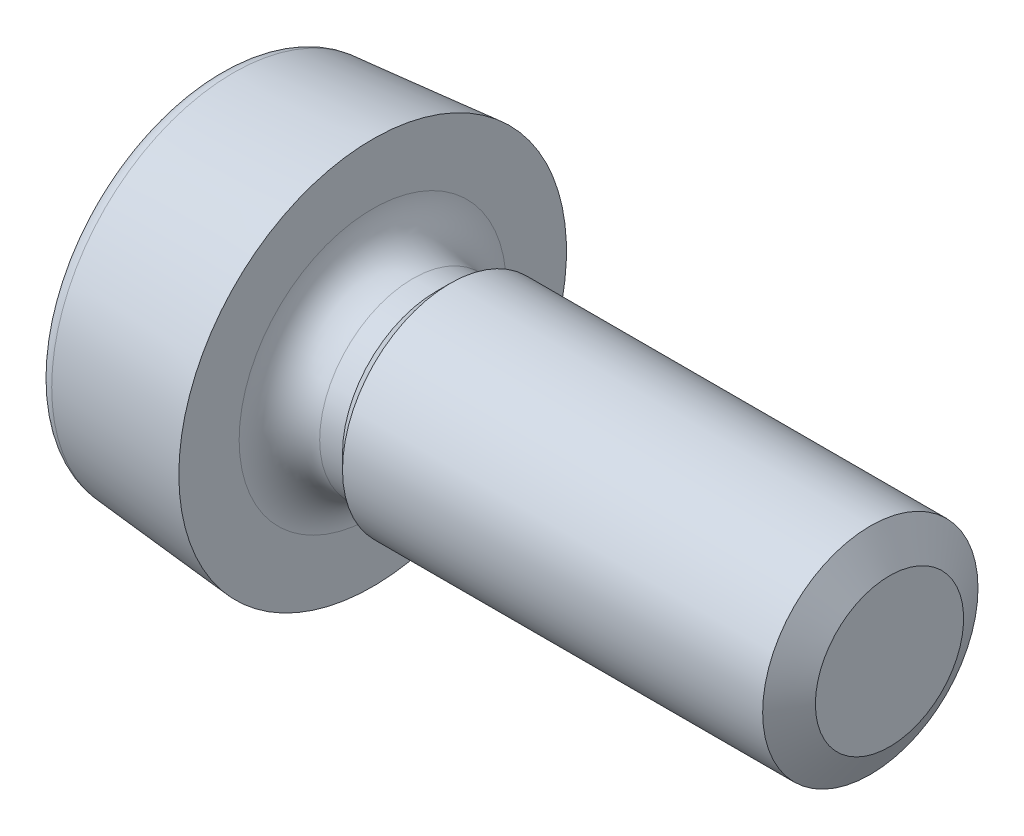
ISO-10303-21;
HEADER;
FILE_DESCRIPTION(('STEP AP214'),'2;1');
FILE_NAME('part.step','',(''),(''),'','','');
FILE_SCHEMA(('AUTOMOTIVE_DESIGN { 1 0 10303 214 1 1 1 1 }'));
ENDSEC;
DATA;
#1=APPLICATION_CONTEXT('core data for automotive mechanical design processes');
#2=APPLICATION_PROTOCOL_DEFINITION('international standard','automotive_design',2000,#1);
#3=PRODUCT_CONTEXT('',#1,'mechanical');
#4=PRODUCT('Part','Part','',(#3));
#5=PRODUCT_RELATED_PRODUCT_CATEGORY('part','',(#4));
#6=PRODUCT_DEFINITION_FORMATION('','',#4);
#7=PRODUCT_DEFINITION_CONTEXT('part definition',#1,'design');
#8=PRODUCT_DEFINITION('design','',#6,#7);
#9=PRODUCT_DEFINITION_SHAPE('','',#8);
#10=(LENGTH_UNIT() NAMED_UNIT(*) SI_UNIT(.MILLI.,.METRE.));
#11=(NAMED_UNIT(*) PLANE_ANGLE_UNIT() SI_UNIT($,.RADIAN.));
#12=(NAMED_UNIT(*) SI_UNIT($,.STERADIAN.) SOLID_ANGLE_UNIT());
#13=UNCERTAINTY_MEASURE_WITH_UNIT(LENGTH_MEASURE(1.E-05),#10,'distance_accuracy_value','');
#14=(GEOMETRIC_REPRESENTATION_CONTEXT(3) GLOBAL_UNCERTAINTY_ASSIGNED_CONTEXT((#13)) GLOBAL_UNIT_ASSIGNED_CONTEXT((#10,
#11,#12)) REPRESENTATION_CONTEXT('',''));
#15=CARTESIAN_POINT('',(0.,0.,0.));
#16=DIRECTION('',(0.,0.,1.));
#17=DIRECTION('',(1.,0.,0.));
#18=AXIS2_PLACEMENT_3D('',#15,#16,#17);
#19=CARTESIAN_POINT('',(0.,1.90925417084986,0.));
#20=DIRECTION('',(1.,0.,0.));
#21=DIRECTION('',(0.,0.,-1.));
#22=AXIS2_PLACEMENT_3D('',#19,#20,#21);
#23=PLANE('',#22);
#24=CARTESIAN_POINT('',(0.,0.,0.));
#25=DIRECTION('',(-1.,0.,0.));
#26=DIRECTION('',(0.,0.,1.));
#27=AXIS2_PLACEMENT_3D('',#24,#25,#26);
#28=CIRCLE('',#27,1.90925417084986);
#29=CARTESIAN_POINT('',(0.,0.,1.90925417084986));
#30=VERTEX_POINT('',#29);
#31=EDGE_CURVE('E197',#30,#30,#28,.T.);
#32=ORIENTED_EDGE('',*,*,#31,.T.);
#33=EDGE_LOOP('',(#32));
#34=FACE_BOUND('',#33,.T.);
#35=DIRECTION('',(0.,0.,1.));
#36=VECTOR('',#35,1.);
#37=CARTESIAN_POINT('',(0.,-0.225000000000005,1.35));
#38=LINE('',#37,#36);
#39=CARTESIAN_POINT('',(0.,-0.225000000000001,0.225));
#40=VERTEX_POINT('',#39);
#41=CARTESIAN_POINT('',(0.,-0.225000000000005,1.35));
#42=VERTEX_POINT('',#41);
#43=EDGE_CURVE('E147',#40,#42,#38,.T.);
#44=ORIENTED_EDGE('',*,*,#43,.F.);
#45=DIRECTION('',(0.,1.,0.));
#46=VECTOR('',#45,1.);
#47=CARTESIAN_POINT('',(0.,1.35,0.225));
#48=LINE('',#47,#46);
#49=CARTESIAN_POINT('',(0.,-1.35,0.225));
#50=VERTEX_POINT('',#49);
#51=EDGE_CURVE('E175',#50,#40,#48,.T.);
#52=ORIENTED_EDGE('',*,*,#51,.F.);
#53=DIRECTION('',(0.,0.,1.));
#54=VECTOR('',#53,1.);
#55=CARTESIAN_POINT('',(0.,-1.35,-0.225));
#56=LINE('',#55,#54);
#57=CARTESIAN_POINT('',(0.,-1.35,-0.225));
#58=VERTEX_POINT('',#57);
#59=EDGE_CURVE('E164',#58,#50,#56,.T.);
#60=ORIENTED_EDGE('',*,*,#59,.F.);
#61=DIRECTION('',(0.,-1.,0.));
#62=VECTOR('',#61,1.);
#63=CARTESIAN_POINT('',(0.,1.35,-0.225));
#64=LINE('',#63,#62);
#65=CARTESIAN_POINT('',(0.,-0.224999999999999,-0.225));
#66=VERTEX_POINT('',#65);
#67=EDGE_CURVE('E85',#66,#58,#64,.T.);
#68=ORIENTED_EDGE('',*,*,#67,.F.);
#69=CARTESIAN_POINT('',(0.,-0.224999999999995,-1.35));
#70=VERTEX_POINT('',#69);
#71=EDGE_CURVE('E100',#70,#66,#38,.T.);
#72=ORIENTED_EDGE('',*,*,#71,.F.);
#73=DIRECTION('',(0.,-1.,0.));
#74=VECTOR('',#73,1.);
#75=CARTESIAN_POINT('',(0.,0.225000000000005,-1.35));
#76=LINE('',#75,#74);
#77=CARTESIAN_POINT('',(0.,0.225000000000005,-1.35));
#78=VERTEX_POINT('',#77);
#79=EDGE_CURVE('E141',#78,#70,#76,.T.);
#80=ORIENTED_EDGE('',*,*,#79,.F.);
#81=DIRECTION('',(0.,0.,-1.));
#82=VECTOR('',#81,1.);
#83=CARTESIAN_POINT('',(0.,0.224999999999995,1.35));
#84=LINE('',#83,#82);
#85=CARTESIAN_POINT('',(0.,0.225000000000001,-0.225));
#86=VERTEX_POINT('',#85);
#87=EDGE_CURVE('E142',#86,#78,#84,.T.);
#88=ORIENTED_EDGE('',*,*,#87,.F.);
#89=CARTESIAN_POINT('',(0.,1.35,-0.225));
#90=VERTEX_POINT('',#89);
#91=EDGE_CURVE('E168',#90,#86,#64,.T.);
#92=ORIENTED_EDGE('',*,*,#91,.F.);
#93=DIRECTION('',(0.,0.,-1.));
#94=VECTOR('',#93,1.);
#95=CARTESIAN_POINT('',(0.,1.35,-0.225));
#96=LINE('',#95,#94);
#97=CARTESIAN_POINT('',(0.,1.35,0.225));
#98=VERTEX_POINT('',#97);
#99=EDGE_CURVE('E171',#98,#90,#96,.T.);
#100=ORIENTED_EDGE('',*,*,#99,.F.);
#101=CARTESIAN_POINT('',(0.,0.224999999999999,0.225));
#102=VERTEX_POINT('',#101);
#103=EDGE_CURVE('E70',#102,#98,#48,.T.);
#104=ORIENTED_EDGE('',*,*,#103,.F.);
#105=CARTESIAN_POINT('',(0.,0.224999999999995,1.35));
#106=VERTEX_POINT('',#105);
#107=EDGE_CURVE('E133',#106,#102,#84,.T.);
#108=ORIENTED_EDGE('',*,*,#107,.F.);
#109=DIRECTION('',(0.,1.,0.));
#110=VECTOR('',#109,1.);
#111=CARTESIAN_POINT('',(0.,0.224999999999995,1.35));
#112=LINE('',#111,#110);
#113=EDGE_CURVE('E120',#42,#106,#112,.T.);
#114=ORIENTED_EDGE('',*,*,#113,.F.);
#115=EDGE_LOOP('',(#44,#52,#60,#68,#72,#80,#88,#92,#100,#104,#108,#114));
#116=FACE_BOUND('',#115,.T.);
#117=ADVANCED_FACE('F46',(#34,#116),#23,.F.);
#118=CARTESIAN_POINT('',(1.2,0.,0.));
#119=DIRECTION('',(-0.184288535050185,0.,-0.982872186934322));
#120=DIRECTION('',(-0.982872186934322,0.,0.184288535050185));
#121=AXIS2_PLACEMENT_3D('',#118,#119,#120);
#122=PLANE('',#121);
#123=ORIENTED_EDGE('',*,*,#51,.T.);
#124=DIRECTION('',(0.966595349328283,0.181236627999054,-0.181236627999053));
#125=VECTOR('',#124,1.);
#126=CARTESIAN_POINT('',(1.2,0.,0.));
#127=LINE('',#126,#125);
#128=CARTESIAN_POINT('',(1.2,0.,0.));
#129=VERTEX_POINT('',#128);
#130=EDGE_CURVE('E92',#40,#129,#127,.T.);
#131=ORIENTED_EDGE('',*,*,#130,.T.);
#132=DIRECTION('',(0.659268514744263,0.741677079087296,-0.123612846514549));
#133=VECTOR('',#132,1.);
#134=CARTESIAN_POINT('',(0.,-1.35,0.225));
#135=LINE('',#134,#133);
#136=EDGE_CURVE('E182',#50,#129,#135,.T.);
#137=ORIENTED_EDGE('',*,*,#136,.F.);
#138=EDGE_LOOP('',(#123,#131,#137));
#139=FACE_BOUND('',#138,.T.);
#140=ADVANCED_FACE('F238',(#139),#122,.T.);
#141=DIRECTION('',(0.659268514744263,-0.741677079087296,-0.123612846514549));
#142=VECTOR('',#141,1.);
#143=CARTESIAN_POINT('',(0.,1.35,0.225));
#144=LINE('',#143,#142);
#145=EDGE_CURVE('E179',#98,#129,#144,.T.);
#146=ORIENTED_EDGE('',*,*,#145,.T.);
#147=DIRECTION('',(-0.966595349328283,0.181236627999053,0.181236627999053));
#148=VECTOR('',#147,1.);
#149=CARTESIAN_POINT('',(1.2,0.,0.));
#150=LINE('',#149,#148);
#151=EDGE_CURVE('E129',#129,#102,#150,.T.);
#152=ORIENTED_EDGE('',*,*,#151,.T.);
#153=ORIENTED_EDGE('',*,*,#103,.T.);
#154=EDGE_LOOP('',(#146,#152,#153));
#155=FACE_BOUND('',#154,.T.);
#156=ADVANCED_FACE('F231',(#155),#122,.T.);
#157=CARTESIAN_POINT('',(1.2,0.,0.));
#158=DIRECTION('',(-0.184288535050185,0.,0.982872186934322));
#159=DIRECTION('',(0.982872186934322,0.,0.184288535050185));
#160=AXIS2_PLACEMENT_3D('',#157,#158,#159);
#161=PLANE('',#160);
#162=DIRECTION('',(0.659268514744263,0.741677079087296,0.123612846514549));
#163=VECTOR('',#162,1.);
#164=CARTESIAN_POINT('',(0.,-1.35,-0.225));
#165=LINE('',#164,#163);
#166=EDGE_CURVE('E163',#58,#129,#165,.T.);
#167=ORIENTED_EDGE('',*,*,#166,.T.);
#168=DIRECTION('',(-0.966595349328283,-0.181236627999053,-0.181236627999053));
#169=VECTOR('',#168,1.);
#170=CARTESIAN_POINT('',(1.2,0.,0.));
#171=LINE('',#170,#169);
#172=EDGE_CURVE('E11',#129,#66,#171,.T.);
#173=ORIENTED_EDGE('',*,*,#172,.T.);
#174=ORIENTED_EDGE('',*,*,#67,.T.);
#175=EDGE_LOOP('',(#167,#173,#174));
#176=FACE_BOUND('',#175,.T.);
#177=ADVANCED_FACE('F232',(#176),#161,.T.);
#178=ORIENTED_EDGE('',*,*,#91,.T.);
#179=DIRECTION('',(0.966595349328283,-0.181236627999054,0.181236627999053));
#180=VECTOR('',#179,1.);
#181=CARTESIAN_POINT('',(1.2,0.,0.));
#182=LINE('',#181,#180);
#183=EDGE_CURVE('E54',#86,#129,#182,.T.);
#184=ORIENTED_EDGE('',*,*,#183,.T.);
#185=DIRECTION('',(0.659268514744263,-0.741677079087296,0.123612846514549));
#186=VECTOR('',#185,1.);
#187=CARTESIAN_POINT('',(0.,1.35,-0.225));
#188=LINE('',#187,#186);
#189=EDGE_CURVE('E61',#90,#129,#188,.T.);
#190=ORIENTED_EDGE('',*,*,#189,.F.);
#191=EDGE_LOOP('',(#178,#184,#190));
#192=FACE_BOUND('',#191,.T.);
#193=ADVANCED_FACE('F225',(#192),#161,.T.);
#194=CARTESIAN_POINT('',(-2.16958058991907,0.,0.));
#195=DIRECTION('',(-1.,0.,0.));
#196=DIRECTION('',(0.,0.,1.));
#197=AXIS2_PLACEMENT_3D('',#194,#195,#196);
#198=CYLINDRICAL_SURFACE('',#197,1.25);
#199=CARTESIAN_POINT('',(2.7,0.,0.));
#200=DIRECTION('',(-1.,0.,0.));
#201=DIRECTION('',(0.,0.,1.));
#202=AXIS2_PLACEMENT_3D('',#199,#200,#201);
#203=CIRCLE('',#202,1.25);
#204=CARTESIAN_POINT('',(2.7,0.,1.25));
#205=VERTEX_POINT('',#204);
#206=EDGE_CURVE('E221',#205,#205,#203,.T.);
#207=ORIENTED_EDGE('',*,*,#206,.F.);
#208=EDGE_LOOP('',(#207));
#209=FACE_BOUND('',#208,.T.);
#210=CARTESIAN_POINT('',(7.57743720258487,0.,0.));
#211=DIRECTION('',(-1.,0.,0.));
#212=DIRECTION('',(0.,0.,1.));
#213=AXIS2_PLACEMENT_3D('',#210,#211,#212);
#214=CIRCLE('',#213,1.25);
#215=CARTESIAN_POINT('',(7.57743720258487,0.,1.25));
#216=VERTEX_POINT('',#215);
#217=EDGE_CURVE('E193',#216,#216,#214,.T.);
#218=ORIENTED_EDGE('',*,*,#217,.T.);
#219=EDGE_LOOP('',(#218));
#220=FACE_BOUND('',#219,.T.);
#221=ADVANCED_FACE('F312',(#209,#220),#198,.T.);
#222=CARTESIAN_POINT('',(2.7,0.,0.));
#223=DIRECTION('',(1.,0.,0.));
#224=DIRECTION('',(0.,0.,-1.));
#225=AXIS2_PLACEMENT_3D('',#222,#223,#224);
#226=CONICAL_SURFACE('',#225,1.25,0.785398163397442);
#227=CARTESIAN_POINT('',(2.5325,0.,0.));
#228=DIRECTION('',(-1.,0.,0.));
#229=DIRECTION('',(0.,0.,1.));
#230=AXIS2_PLACEMENT_3D('',#227,#228,#229);
#231=CIRCLE('',#230,1.0825);
#232=CARTESIAN_POINT('',(2.5325,0.,1.0825));
#233=VERTEX_POINT('',#232);
#234=EDGE_CURVE('E217',#233,#233,#231,.T.);
#235=ORIENTED_EDGE('',*,*,#234,.F.);
#236=EDGE_LOOP('',(#235));
#237=FACE_BOUND('',#236,.T.);
#238=ORIENTED_EDGE('',*,*,#206,.T.);
#239=EDGE_LOOP('',(#238));
#240=FACE_BOUND('',#239,.T.);
#241=ADVANCED_FACE('F265',(#237,#240),#226,.T.);
#242=CARTESIAN_POINT('',(-2.16958058991907,0.,0.));
#243=DIRECTION('',(-1.,0.,0.));
#244=DIRECTION('',(0.,0.,1.));
#245=AXIS2_PLACEMENT_3D('',#242,#243,#244);
#246=CYLINDRICAL_SURFACE('',#245,1.0825);
#247=CARTESIAN_POINT('',(2.2675,0.,0.));
#248=DIRECTION('',(-1.,0.,0.));
#249=DIRECTION('',(0.,0.,1.));
#250=AXIS2_PLACEMENT_3D('',#247,#248,#249);
#251=CIRCLE('',#250,1.0825);
#252=CARTESIAN_POINT('',(2.2675,0.,1.0825));
#253=VERTEX_POINT('',#252);
#254=EDGE_CURVE('E213',#253,#253,#251,.T.);
#255=ORIENTED_EDGE('',*,*,#254,.F.);
#256=EDGE_LOOP('',(#255));
#257=FACE_BOUND('',#256,.T.);
#258=ORIENTED_EDGE('',*,*,#234,.T.);
#259=EDGE_LOOP('',(#258));
#260=FACE_BOUND('',#259,.T.);
#261=ADVANCED_FACE('F259',(#257,#260),#246,.T.);
#262=CARTESIAN_POINT('',(2.2675,0.,0.));
#263=DIRECTION('',(-1.,0.,0.));
#264=DIRECTION('',(0.,0.,1.));
#265=AXIS2_PLACEMENT_3D('',#262,#263,#264);
#266=TOROIDAL_SURFACE('',#265,1.55,0.4675);
#267=CARTESIAN_POINT('',(1.8,0.,0.));
#268=DIRECTION('',(-1.,0.,0.));
#269=DIRECTION('',(0.,0.,1.));
#270=AXIS2_PLACEMENT_3D('',#267,#268,#269);
#271=CIRCLE('',#270,1.55);
#272=CARTESIAN_POINT('',(1.8,0.,1.55));
#273=VERTEX_POINT('',#272);
#274=EDGE_CURVE('E209',#273,#273,#271,.T.);
#275=ORIENTED_EDGE('',*,*,#274,.F.);
#276=EDGE_LOOP('',(#275));
#277=FACE_BOUND('',#276,.T.);
#278=ORIENTED_EDGE('',*,*,#254,.T.);
#279=EDGE_LOOP('',(#278));
#280=FACE_BOUND('',#279,.T.);
#281=ADVANCED_FACE('F264',(#277,#280),#266,.F.);
#282=CARTESIAN_POINT('',(1.8,1.55,0.));
#283=DIRECTION('',(-1.,0.,0.));
#284=DIRECTION('',(0.,0.,1.));
#285=AXIS2_PLACEMENT_3D('',#282,#283,#284);
#286=PLANE('',#285);
#287=CARTESIAN_POINT('',(1.8,0.,0.));
#288=DIRECTION('',(-1.,0.,0.));
#289=DIRECTION('',(0.,0.,1.));
#290=AXIS2_PLACEMENT_3D('',#287,#288,#289);
#291=CIRCLE('',#290,2.25);
#292=CARTESIAN_POINT('',(1.8,0.,2.25));
#293=VERTEX_POINT('',#292);
#294=EDGE_CURVE('E205',#293,#293,#291,.T.);
#295=ORIENTED_EDGE('',*,*,#294,.F.);
#296=EDGE_LOOP('',(#295));
#297=FACE_BOUND('',#296,.T.);
#298=ORIENTED_EDGE('',*,*,#274,.T.);
#299=EDGE_LOOP('',(#298));
#300=FACE_BOUND('',#299,.T.);
#301=ADVANCED_FACE('F275',(#297,#300),#286,.F.);
#302=CARTESIAN_POINT('',(1.8,0.,0.));
#303=DIRECTION('',(1.,0.,0.));
#304=DIRECTION('',(0.,0.,-1.));
#305=AXIS2_PLACEMENT_3D('',#302,#303,#304);
#306=CONICAL_SURFACE('',#305,2.25,0.0872664625997097);
#307=CARTESIAN_POINT('',(0.18256885145047,0.,0.));
#308=DIRECTION('',(-1.,0.,0.));
#309=DIRECTION('',(0.,0.,1.));
#310=AXIS2_PLACEMENT_3D('',#307,#308,#309);
#311=CIRCLE('',#310,2.10849311046821);
#312=CARTESIAN_POINT('',(0.18256885145047,0.,2.10849311046821));
#313=VERTEX_POINT('',#312);
#314=EDGE_CURVE('E201',#313,#313,#311,.T.);
#315=ORIENTED_EDGE('',*,*,#314,.F.);
#316=EDGE_LOOP('',(#315));
#317=FACE_BOUND('',#316,.T.);
#318=ORIENTED_EDGE('',*,*,#294,.T.);
#319=EDGE_LOOP('',(#318));
#320=FACE_BOUND('',#319,.T.);
#321=ADVANCED_FACE('F279',(#317,#320),#306,.T.);
#322=CARTESIAN_POINT('',(0.2,0.,0.));
#323=DIRECTION('',(-1.,0.,0.));
#324=DIRECTION('',(0.,0.,1.));
#325=AXIS2_PLACEMENT_3D('',#322,#323,#324);
#326=TOROIDAL_SURFACE('',#325,1.90925417084986,0.2);
#327=ORIENTED_EDGE('',*,*,#31,.F.);
#328=EDGE_LOOP('',(#327));
#329=FACE_BOUND('',#328,.T.);
#330=ORIENTED_EDGE('',*,*,#314,.T.);
#331=EDGE_LOOP('',(#330));
#332=FACE_BOUND('',#331,.T.);
#333=ADVANCED_FACE('F290',(#329,#332),#326,.T.);
#334=CARTESIAN_POINT('',(7.57743720258487,0.,0.));
#335=DIRECTION('',(-1.,0.,0.));
#336=DIRECTION('',(0.,0.,1.));
#337=AXIS2_PLACEMENT_3D('',#334,#335,#336);
#338=CONICAL_SURFACE('',#337,1.25,1.0518880185528);
#339=CARTESIAN_POINT('',(7.8,0.,0.));
#340=DIRECTION('',(-1.,0.,0.));
#341=DIRECTION('',(0.,0.,1.));
#342=AXIS2_PLACEMENT_3D('',#339,#340,#341);
#343=CIRCLE('',#342,0.860299999999999);
#344=CARTESIAN_POINT('',(7.8,0.,0.860299999999999));
#345=VERTEX_POINT('',#344);
#346=EDGE_CURVE('E174',#345,#345,#343,.T.);
#347=ORIENTED_EDGE('',*,*,#346,.T.);
#348=EDGE_LOOP('',(#347));
#349=FACE_BOUND('',#348,.T.);
#350=ORIENTED_EDGE('',*,*,#217,.F.);
#351=EDGE_LOOP('',(#350));
#352=FACE_BOUND('',#351,.T.);
#353=ADVANCED_FACE('F250',(#349,#352),#338,.T.);
#354=CARTESIAN_POINT('',(7.8,0.,0.));
#355=DIRECTION('',(-1.,0.,0.));
#356=DIRECTION('',(0.,0.,1.));
#357=AXIS2_PLACEMENT_3D('',#354,#355,#356);
#358=PLANE('',#357);
#359=ORIENTED_EDGE('',*,*,#346,.F.);
#360=EDGE_LOOP('',(#359));
#361=FACE_BOUND('',#360,.T.);
#362=ADVANCED_FACE('F245',(#361),#358,.F.);
#363=CARTESIAN_POINT('',(0.,1.35,0.225));
#364=DIRECTION('',(0.74740931868366,0.66436383882992,0.));
#365=DIRECTION('',(-0.66436383882992,0.74740931868366,0.));
#366=AXIS2_PLACEMENT_3D('',#363,#364,#365);
#367=PLANE('',#366);
#368=ORIENTED_EDGE('',*,*,#145,.F.);
#369=ORIENTED_EDGE('',*,*,#99,.T.);
#370=ORIENTED_EDGE('',*,*,#189,.T.);
#371=EDGE_LOOP('',(#368,#369,#370));
#372=FACE_BOUND('',#371,.T.);
#373=ADVANCED_FACE('F230',(#372),#367,.F.);
#374=CARTESIAN_POINT('',(0.,-1.35,-0.225));
#375=DIRECTION('',(0.74740931868366,-0.66436383882992,0.));
#376=DIRECTION('',(0.66436383882992,0.74740931868366,0.));
#377=AXIS2_PLACEMENT_3D('',#374,#375,#376);
#378=PLANE('',#377);
#379=ORIENTED_EDGE('',*,*,#166,.F.);
#380=ORIENTED_EDGE('',*,*,#59,.T.);
#381=ORIENTED_EDGE('',*,*,#136,.T.);
#382=EDGE_LOOP('',(#379,#380,#381));
#383=FACE_BOUND('',#382,.T.);
#384=ADVANCED_FACE('F235',(#383),#378,.F.);
#385=CARTESIAN_POINT('',(1.2,0.,0.));
#386=DIRECTION('',(-0.184288535050185,0.982872186934322,0.));
#387=DIRECTION('',(-0.982872186934322,-0.184288535050185,0.));
#388=AXIS2_PLACEMENT_3D('',#385,#386,#387);
#389=PLANE('',#388);
#390=DIRECTION('',(0.659268514744263,0.123612846514547,0.741677079087297));
#391=VECTOR('',#390,1.);
#392=CARTESIAN_POINT('',(0.,-0.224999999999995,-1.35));
#393=LINE('',#392,#391);
#394=EDGE_CURVE('E136',#70,#129,#393,.T.);
#395=ORIENTED_EDGE('',*,*,#394,.F.);
#396=ORIENTED_EDGE('',*,*,#71,.T.);
#397=ORIENTED_EDGE('',*,*,#172,.F.);
#398=EDGE_LOOP('',(#395,#396,#397));
#399=FACE_BOUND('',#398,.T.);
#400=ADVANCED_FACE('F377',(#399),#389,.T.);
#401=CARTESIAN_POINT('',(1.2,0.,0.));
#402=DIRECTION('',(-0.184288535050185,-0.982872186934322,0.));
#403=DIRECTION('',(0.982872186934322,-0.184288535050185,0.));
#404=AXIS2_PLACEMENT_3D('',#401,#402,#403);
#405=PLANE('',#404);
#406=ORIENTED_EDGE('',*,*,#87,.T.);
#407=DIRECTION('',(0.659268514744263,-0.123612846514552,0.741677079087296));
#408=VECTOR('',#407,1.);
#409=CARTESIAN_POINT('',(0.,0.225000000000005,-1.35));
#410=LINE('',#409,#408);
#411=EDGE_CURVE('E137',#78,#129,#410,.T.);
#412=ORIENTED_EDGE('',*,*,#411,.T.);
#413=ORIENTED_EDGE('',*,*,#183,.F.);
#414=EDGE_LOOP('',(#406,#412,#413));
#415=FACE_BOUND('',#414,.T.);
#416=ADVANCED_FACE('F425',(#415),#405,.T.);
#417=CARTESIAN_POINT('',(0.,0.225000000000005,-1.35));
#418=DIRECTION('',(0.74740931868366,0.,-0.66436383882992));
#419=DIRECTION('',(0.66436383882992,0.,0.74740931868366));
#420=AXIS2_PLACEMENT_3D('',#417,#418,#419);
#421=PLANE('',#420);
#422=ORIENTED_EDGE('',*,*,#411,.F.);
#423=ORIENTED_EDGE('',*,*,#79,.T.);
#424=ORIENTED_EDGE('',*,*,#394,.T.);
#425=EDGE_LOOP('',(#422,#423,#424));
#426=FACE_BOUND('',#425,.T.);
#427=ADVANCED_FACE('F435',(#426),#421,.F.);
#428=ORIENTED_EDGE('',*,*,#43,.T.);
#429=DIRECTION('',(0.659268514744263,0.123612846514552,-0.741677079087296));
#430=VECTOR('',#429,1.);
#431=CARTESIAN_POINT('',(0.,-0.225000000000005,1.35));
#432=LINE('',#431,#430);
#433=EDGE_CURVE('E125',#42,#129,#432,.T.);
#434=ORIENTED_EDGE('',*,*,#433,.T.);
#435=ORIENTED_EDGE('',*,*,#130,.F.);
#436=EDGE_LOOP('',(#428,#434,#435));
#437=FACE_BOUND('',#436,.T.);
#438=ADVANCED_FACE('F427',(#437),#389,.T.);
#439=DIRECTION('',(0.659268514744263,-0.123612846514547,-0.741677079087297));
#440=VECTOR('',#439,1.);
#441=CARTESIAN_POINT('',(0.,0.224999999999995,1.35));
#442=LINE('',#441,#440);
#443=EDGE_CURVE('E123',#106,#129,#442,.T.);
#444=ORIENTED_EDGE('',*,*,#443,.F.);
#445=ORIENTED_EDGE('',*,*,#107,.T.);
#446=ORIENTED_EDGE('',*,*,#151,.F.);
#447=EDGE_LOOP('',(#444,#445,#446));
#448=FACE_BOUND('',#447,.T.);
#449=ADVANCED_FACE('F132',(#448),#405,.T.);
#450=CARTESIAN_POINT('',(0.,-0.225000000000005,1.35));
#451=DIRECTION('',(0.74740931868366,0.,0.66436383882992));
#452=DIRECTION('',(-0.66436383882992,0.,0.74740931868366));
#453=AXIS2_PLACEMENT_3D('',#450,#451,#452);
#454=PLANE('',#453);
#455=ORIENTED_EDGE('',*,*,#433,.F.);
#456=ORIENTED_EDGE('',*,*,#113,.T.);
#457=ORIENTED_EDGE('',*,*,#443,.T.);
#458=EDGE_LOOP('',(#455,#456,#457));
#459=FACE_BOUND('',#458,.T.);
#460=ADVANCED_FACE('F122',(#459),#454,.F.);
#461=CLOSED_SHELL('',(#117,#140,#156,#177,#193,#221,#241,#261,#281,#301,#321,#333,#353,#362,
#373,#384,#400,#416,#427,#438,#449,#460));
#462=MANIFOLD_SOLID_BREP('B2',#461);
#463=ADVANCED_BREP_SHAPE_REPRESENTATION('',(#18,#462),#14);
#464=SHAPE_DEFINITION_REPRESENTATION(#9,#463);
ENDSEC;
END-ISO-10303-21;
